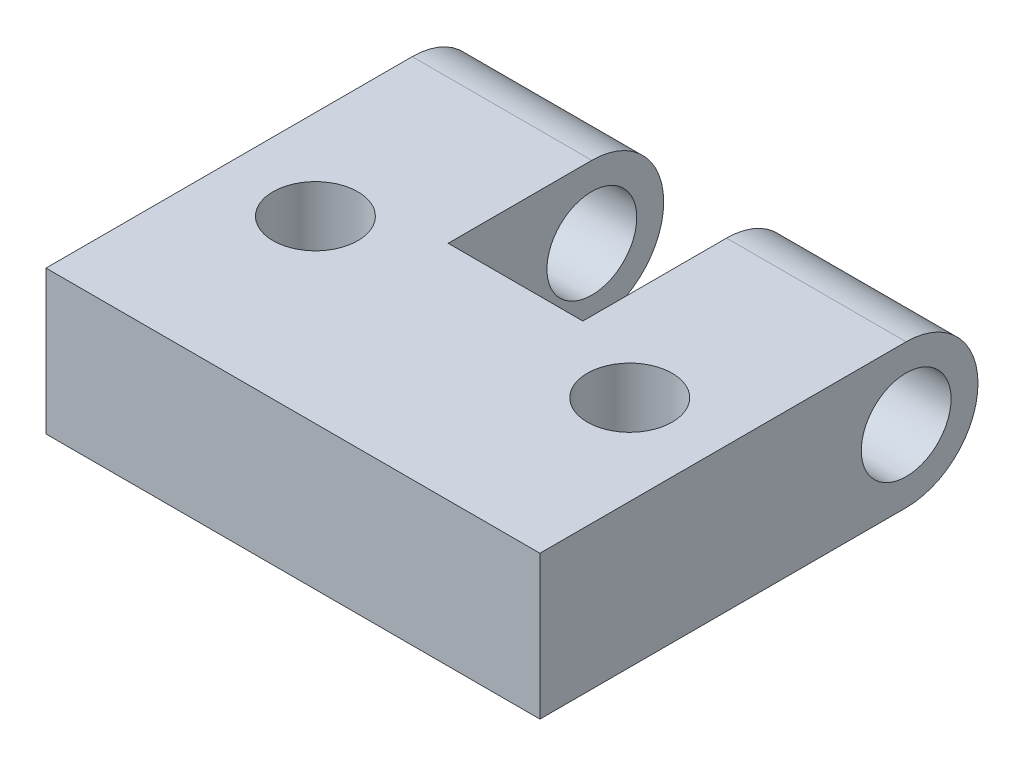
ISO-10303-21;
HEADER;
FILE_DESCRIPTION(('STEP AP214'),'2;1');
FILE_NAME('part.step','',(''),(''),'','','');
FILE_SCHEMA(('AUTOMOTIVE_DESIGN { 1 0 10303 214 1 1 1 1 }'));
ENDSEC;
DATA;
#1=APPLICATION_CONTEXT('core data for automotive mechanical design processes');
#2=APPLICATION_PROTOCOL_DEFINITION('international standard','automotive_design',2000,#1);
#3=PRODUCT_CONTEXT('',#1,'mechanical');
#4=PRODUCT('Part','Part','',(#3));
#5=PRODUCT_RELATED_PRODUCT_CATEGORY('part','',(#4));
#6=PRODUCT_DEFINITION_FORMATION('','',#4);
#7=PRODUCT_DEFINITION_CONTEXT('part definition',#1,'design');
#8=PRODUCT_DEFINITION('design','',#6,#7);
#9=PRODUCT_DEFINITION_SHAPE('','',#8);
#10=(LENGTH_UNIT() NAMED_UNIT(*) SI_UNIT(.MILLI.,.METRE.));
#11=(NAMED_UNIT(*) PLANE_ANGLE_UNIT() SI_UNIT($,.RADIAN.));
#12=(NAMED_UNIT(*) SI_UNIT($,.STERADIAN.) SOLID_ANGLE_UNIT());
#13=UNCERTAINTY_MEASURE_WITH_UNIT(LENGTH_MEASURE(1.E-05),#10,'distance_accuracy_value','');
#14=(GEOMETRIC_REPRESENTATION_CONTEXT(3) GLOBAL_UNCERTAINTY_ASSIGNED_CONTEXT((#13)) GLOBAL_UNIT_ASSIGNED_CONTEXT((#10,
#11,#12)) REPRESENTATION_CONTEXT('',''));
#15=CARTESIAN_POINT('',(0.,0.,0.));
#16=DIRECTION('',(0.,0.,1.));
#17=DIRECTION('',(1.,0.,0.));
#18=AXIS2_PLACEMENT_3D('',#15,#16,#17);
#19=CARTESIAN_POINT('',(6.35,5.08,0.));
#20=DIRECTION('',(0.,-1.,0.));
#21=DIRECTION('',(0.,0.,-1.));
#22=AXIS2_PLACEMENT_3D('',#19,#20,#21);
#23=PLANE('',#22);
#24=CARTESIAN_POINT('',(14.2875,5.08,0.));
#25=DIRECTION('',(0.,-1.,0.));
#26=DIRECTION('',(0.,0.,1.));
#27=AXIS2_PLACEMENT_3D('',#24,#25,#26);
#28=CIRCLE('',#27,1.5);
#29=CARTESIAN_POINT('',(14.2875,5.08,1.5));
#30=VERTEX_POINT('',#29);
#31=EDGE_CURVE('E171',#30,#30,#28,.T.);
#32=ORIENTED_EDGE('',*,*,#31,.T.);
#33=EDGE_LOOP('',(#32));
#34=FACE_BOUND('',#33,.T.);
#35=CARTESIAN_POINT('',(3.175,5.08,0.));
#36=DIRECTION('',(0.,1.,0.));
#37=DIRECTION('',(0.,0.,1.));
#38=AXIS2_PLACEMENT_3D('',#35,#36,#37);
#39=CIRCLE('',#38,1.5);
#40=CARTESIAN_POINT('',(3.175,5.08,1.5));
#41=VERTEX_POINT('',#40);
#42=EDGE_CURVE('E127',#41,#41,#39,.T.);
#43=ORIENTED_EDGE('',*,*,#42,.F.);
#44=EDGE_LOOP('',(#43));
#45=FACE_BOUND('',#44,.T.);
#46=DIRECTION('',(0.,0.,1.));
#47=VECTOR('',#46,1.);
#48=CARTESIAN_POINT('',(0.,5.08,0.));
#49=LINE('',#48,#47);
#50=CARTESIAN_POINT('',(0.,5.08,-6.59780487804878));
#51=VERTEX_POINT('',#50);
#52=CARTESIAN_POINT('',(0.,5.08,6.35));
#53=VERTEX_POINT('',#52);
#54=EDGE_CURVE('E80',#51,#53,#49,.T.);
#55=ORIENTED_EDGE('',*,*,#54,.T.);
#56=DIRECTION('',(-1.,0.,0.));
#57=VECTOR('',#56,1.);
#58=CARTESIAN_POINT('',(6.35,5.08,6.35));
#59=LINE('',#58,#57);
#60=CARTESIAN_POINT('',(17.4625,5.08,6.35));
#61=VERTEX_POINT('',#60);
#62=EDGE_CURVE('E11',#61,#53,#59,.T.);
#63=ORIENTED_EDGE('',*,*,#62,.F.);
#64=DIRECTION('',(0.,0.,1.));
#65=VECTOR('',#64,1.);
#66=CARTESIAN_POINT('',(17.4625,5.08,0.));
#67=LINE('',#66,#65);
#68=CARTESIAN_POINT('',(17.4625,5.08,-6.59780487804878));
#69=VERTEX_POINT('',#68);
#70=EDGE_CURVE('E157',#69,#61,#67,.T.);
#71=ORIENTED_EDGE('',*,*,#70,.F.);
#72=DIRECTION('',(1.,0.,0.));
#73=VECTOR('',#72,1.);
#74=CARTESIAN_POINT('',(11.1125,5.08,-6.59780487804878));
#75=LINE('',#74,#73);
#76=CARTESIAN_POINT('',(11.1125,5.08,-6.59780487804878));
#77=VERTEX_POINT('',#76);
#78=EDGE_CURVE('E139',#77,#69,#75,.T.);
#79=ORIENTED_EDGE('',*,*,#78,.F.);
#80=DIRECTION('',(0.,0.,1.));
#81=VECTOR('',#80,1.);
#82=CARTESIAN_POINT('',(11.1125,5.08,0.));
#83=LINE('',#82,#81);
#84=CARTESIAN_POINT('',(11.1125,5.08,-1.51780487804878));
#85=VERTEX_POINT('',#84);
#86=EDGE_CURVE('E150',#77,#85,#83,.T.);
#87=ORIENTED_EDGE('',*,*,#86,.T.);
#88=DIRECTION('',(-1.,0.,0.));
#89=VECTOR('',#88,1.);
#90=CARTESIAN_POINT('',(11.1125,5.08,-1.51780487804878));
#91=LINE('',#90,#89);
#92=CARTESIAN_POINT('',(6.35,5.08,-1.51780487804878));
#93=VERTEX_POINT('',#92);
#94=EDGE_CURVE('E135',#85,#93,#91,.T.);
#95=ORIENTED_EDGE('',*,*,#94,.T.);
#96=DIRECTION('',(0.,0.,1.));
#97=VECTOR('',#96,1.);
#98=CARTESIAN_POINT('',(6.35,5.08,0.));
#99=LINE('',#98,#97);
#100=CARTESIAN_POINT('',(6.35,5.08,-6.59780487804878));
#101=VERTEX_POINT('',#100);
#102=EDGE_CURVE('E82',#101,#93,#99,.T.);
#103=ORIENTED_EDGE('',*,*,#102,.F.);
#104=DIRECTION('',(-1.,0.,0.));
#105=VECTOR('',#104,1.);
#106=CARTESIAN_POINT('',(6.35,5.08,-6.59780487804878));
#107=LINE('',#106,#105);
#108=EDGE_CURVE('E60',#101,#51,#107,.T.);
#109=ORIENTED_EDGE('',*,*,#108,.T.);
#110=EDGE_LOOP('',(#55,#63,#71,#79,#87,#95,#103,#109));
#111=FACE_BOUND('',#110,.T.);
#112=ADVANCED_FACE('F37',(#34,#45,#111),#23,.F.);
#113=CARTESIAN_POINT('',(6.35,0.,6.35));
#114=DIRECTION('',(0.,0.,-1.));
#115=DIRECTION('',(0.,1.,0.));
#116=AXIS2_PLACEMENT_3D('',#113,#114,#115);
#117=PLANE('',#116);
#118=DIRECTION('',(0.,-1.,0.));
#119=VECTOR('',#118,1.);
#120=CARTESIAN_POINT('',(0.,0.,6.35));
#121=LINE('',#120,#119);
#122=CARTESIAN_POINT('',(0.,0.,6.35));
#123=VERTEX_POINT('',#122);
#124=EDGE_CURVE('E94',#53,#123,#121,.T.);
#125=ORIENTED_EDGE('',*,*,#124,.T.);
#126=DIRECTION('',(-1.,0.,0.));
#127=VECTOR('',#126,1.);
#128=CARTESIAN_POINT('',(6.35,0.,6.35));
#129=LINE('',#128,#127);
#130=CARTESIAN_POINT('',(17.4625,0.,6.35));
#131=VERTEX_POINT('',#130);
#132=EDGE_CURVE('E44',#131,#123,#129,.T.);
#133=ORIENTED_EDGE('',*,*,#132,.F.);
#134=DIRECTION('',(0.,-1.,0.));
#135=VECTOR('',#134,1.);
#136=CARTESIAN_POINT('',(17.4625,0.,6.35));
#137=LINE('',#136,#135);
#138=EDGE_CURVE('E151',#61,#131,#137,.T.);
#139=ORIENTED_EDGE('',*,*,#138,.F.);
#140=ORIENTED_EDGE('',*,*,#62,.T.);
#141=EDGE_LOOP('',(#125,#133,#139,#140));
#142=FACE_BOUND('',#141,.T.);
#143=ADVANCED_FACE('F118',(#142),#117,.F.);
#144=CARTESIAN_POINT('',(6.35,0.,0.));
#145=DIRECTION('',(0.,-1.,0.));
#146=DIRECTION('',(0.,0.,-1.));
#147=AXIS2_PLACEMENT_3D('',#144,#145,#146);
#148=PLANE('',#147);
#149=CARTESIAN_POINT('',(14.2875,0.,0.));
#150=DIRECTION('',(0.,-1.,0.));
#151=DIRECTION('',(0.,0.,1.));
#152=AXIS2_PLACEMENT_3D('',#149,#150,#151);
#153=CIRCLE('',#152,1.5);
#154=CARTESIAN_POINT('',(14.2875,0.,1.5));
#155=VERTEX_POINT('',#154);
#156=EDGE_CURVE('E160',#155,#155,#153,.T.);
#157=ORIENTED_EDGE('',*,*,#156,.F.);
#158=EDGE_LOOP('',(#157));
#159=FACE_BOUND('',#158,.T.);
#160=CARTESIAN_POINT('',(3.175,0.,0.));
#161=DIRECTION('',(0.,1.,0.));
#162=DIRECTION('',(0.,0.,1.));
#163=AXIS2_PLACEMENT_3D('',#160,#161,#162);
#164=CIRCLE('',#163,1.5);
#165=CARTESIAN_POINT('',(3.175,0.,1.5));
#166=VERTEX_POINT('',#165);
#167=EDGE_CURVE('E95',#166,#166,#164,.T.);
#168=ORIENTED_EDGE('',*,*,#167,.T.);
#169=EDGE_LOOP('',(#168));
#170=FACE_BOUND('',#169,.T.);
#171=DIRECTION('',(0.,0.,1.));
#172=VECTOR('',#171,1.);
#173=CARTESIAN_POINT('',(0.,0.,0.));
#174=LINE('',#173,#172);
#175=CARTESIAN_POINT('',(0.,0.,-6.59780487804878));
#176=VERTEX_POINT('',#175);
#177=EDGE_CURVE('E100',#176,#123,#174,.T.);
#178=ORIENTED_EDGE('',*,*,#177,.F.);
#179=DIRECTION('',(-1.,0.,0.));
#180=VECTOR('',#179,1.);
#181=CARTESIAN_POINT('',(6.35,0.,-6.59780487804878));
#182=LINE('',#181,#180);
#183=CARTESIAN_POINT('',(6.35,0.,-6.59780487804878));
#184=VERTEX_POINT('',#183);
#185=EDGE_CURVE('E84',#184,#176,#182,.T.);
#186=ORIENTED_EDGE('',*,*,#185,.F.);
#187=DIRECTION('',(0.,0.,1.));
#188=VECTOR('',#187,1.);
#189=CARTESIAN_POINT('',(6.35,0.,0.));
#190=LINE('',#189,#188);
#191=CARTESIAN_POINT('',(6.35,0.,-1.51780487804878));
#192=VERTEX_POINT('',#191);
#193=EDGE_CURVE('E124',#184,#192,#190,.T.);
#194=ORIENTED_EDGE('',*,*,#193,.T.);
#195=DIRECTION('',(-1.,0.,0.));
#196=VECTOR('',#195,1.);
#197=CARTESIAN_POINT('',(11.1125,0.,-1.51780487804878));
#198=LINE('',#197,#196);
#199=CARTESIAN_POINT('',(11.1125,0.,-1.51780487804878));
#200=VERTEX_POINT('',#199);
#201=EDGE_CURVE('E130',#200,#192,#198,.T.);
#202=ORIENTED_EDGE('',*,*,#201,.F.);
#203=DIRECTION('',(0.,0.,1.));
#204=VECTOR('',#203,1.);
#205=CARTESIAN_POINT('',(11.1125,0.,0.));
#206=LINE('',#205,#204);
#207=CARTESIAN_POINT('',(11.1125,0.,-6.59780487804878));
#208=VERTEX_POINT('',#207);
#209=EDGE_CURVE('E163',#208,#200,#206,.T.);
#210=ORIENTED_EDGE('',*,*,#209,.F.);
#211=DIRECTION('',(1.,0.,0.));
#212=VECTOR('',#211,1.);
#213=CARTESIAN_POINT('',(11.1125,0.,-6.59780487804878));
#214=LINE('',#213,#212);
#215=CARTESIAN_POINT('',(17.4625,0.,-6.59780487804878));
#216=VERTEX_POINT('',#215);
#217=EDGE_CURVE('E144',#208,#216,#214,.T.);
#218=ORIENTED_EDGE('',*,*,#217,.T.);
#219=DIRECTION('',(0.,0.,1.));
#220=VECTOR('',#219,1.);
#221=CARTESIAN_POINT('',(17.4625,0.,0.));
#222=LINE('',#221,#220);
#223=EDGE_CURVE('E114',#216,#131,#222,.T.);
#224=ORIENTED_EDGE('',*,*,#223,.T.);
#225=ORIENTED_EDGE('',*,*,#132,.T.);
#226=EDGE_LOOP('',(#178,#186,#194,#202,#210,#218,#224,#225));
#227=FACE_BOUND('',#226,.T.);
#228=ADVANCED_FACE('F110',(#159,#170,#227),#148,.T.);
#229=CARTESIAN_POINT('',(6.35,2.54,-6.59780487804878));
#230=DIRECTION('',(-1.,0.,0.));
#231=DIRECTION('',(0.,0.,1.));
#232=AXIS2_PLACEMENT_3D('',#229,#230,#231);
#233=CYLINDRICAL_SURFACE('',#232,2.54);
#234=CARTESIAN_POINT('',(0.,2.54,-6.59780487804878));
#235=DIRECTION('',(1.,0.,0.));
#236=DIRECTION('',(0.,0.,-1.));
#237=AXIS2_PLACEMENT_3D('',#234,#235,#236);
#238=CIRCLE('',#237,2.54);
#239=EDGE_CURVE('E92',#51,#176,#238,.F.);
#240=ORIENTED_EDGE('',*,*,#239,.F.);
#241=ORIENTED_EDGE('',*,*,#108,.F.);
#242=CARTESIAN_POINT('',(6.35,2.54,-6.59780487804878));
#243=DIRECTION('',(1.,0.,0.));
#244=DIRECTION('',(0.,0.,-1.));
#245=AXIS2_PLACEMENT_3D('',#242,#243,#244);
#246=CIRCLE('',#245,2.54);
#247=EDGE_CURVE('E122',#101,#184,#246,.F.);
#248=ORIENTED_EDGE('',*,*,#247,.T.);
#249=ORIENTED_EDGE('',*,*,#185,.T.);
#250=EDGE_LOOP('',(#240,#241,#248,#249));
#251=FACE_BOUND('',#250,.T.);
#252=ADVANCED_FACE('F97',(#251),#233,.T.);
#253=CARTESIAN_POINT('',(6.35,2.54,-6.59780487804878));
#254=DIRECTION('',(-1.,0.,0.));
#255=DIRECTION('',(0.,0.,1.));
#256=AXIS2_PLACEMENT_3D('',#253,#254,#255);
#257=CYLINDRICAL_SURFACE('',#256,1.5875);
#258=CARTESIAN_POINT('',(6.35,2.54,-6.59780487804878));
#259=DIRECTION('',(1.,0.,0.));
#260=DIRECTION('',(0.,0.,-1.));
#261=AXIS2_PLACEMENT_3D('',#258,#259,#260);
#262=CIRCLE('',#261,1.5875);
#263=CARTESIAN_POINT('',(6.35,2.54,-8.18530487804878));
#264=VERTEX_POINT('',#263);
#265=EDGE_CURVE('E85',#264,#264,#262,.T.);
#266=ORIENTED_EDGE('',*,*,#265,.T.);
#267=EDGE_LOOP('',(#266));
#268=FACE_BOUND('',#267,.T.);
#269=CARTESIAN_POINT('',(0.,2.54,-6.59780487804878));
#270=DIRECTION('',(1.,0.,0.));
#271=DIRECTION('',(0.,0.,-1.));
#272=AXIS2_PLACEMENT_3D('',#269,#270,#271);
#273=CIRCLE('',#272,1.5875);
#274=CARTESIAN_POINT('',(0.,2.54,-8.18530487804878));
#275=VERTEX_POINT('',#274);
#276=EDGE_CURVE('E99',#275,#275,#273,.T.);
#277=ORIENTED_EDGE('',*,*,#276,.F.);
#278=EDGE_LOOP('',(#277));
#279=FACE_BOUND('',#278,.T.);
#280=ADVANCED_FACE('F225',(#268,#279),#257,.F.);
#281=CARTESIAN_POINT('',(6.35,0.,0.));
#282=DIRECTION('',(1.,0.,0.));
#283=DIRECTION('',(0.,0.,-1.));
#284=AXIS2_PLACEMENT_3D('',#281,#282,#283);
#285=PLANE('',#284);
#286=DIRECTION('',(0.,1.,0.));
#287=VECTOR('',#286,1.);
#288=CARTESIAN_POINT('',(6.35,0.,-1.51780487804878));
#289=LINE('',#288,#287);
#290=EDGE_CURVE('E51',#192,#93,#289,.T.);
#291=ORIENTED_EDGE('',*,*,#290,.F.);
#292=ORIENTED_EDGE('',*,*,#193,.F.);
#293=ORIENTED_EDGE('',*,*,#247,.F.);
#294=ORIENTED_EDGE('',*,*,#102,.T.);
#295=EDGE_LOOP('',(#291,#292,#293,#294));
#296=FACE_BOUND('',#295,.T.);
#297=ORIENTED_EDGE('',*,*,#265,.F.);
#298=EDGE_LOOP('',(#297));
#299=FACE_BOUND('',#298,.T.);
#300=ADVANCED_FACE('F222',(#296,#299),#285,.T.);
#301=CARTESIAN_POINT('',(0.,0.,0.));
#302=DIRECTION('',(1.,0.,0.));
#303=DIRECTION('',(0.,0.,-1.));
#304=AXIS2_PLACEMENT_3D('',#301,#302,#303);
#305=PLANE('',#304);
#306=ORIENTED_EDGE('',*,*,#54,.F.);
#307=ORIENTED_EDGE('',*,*,#239,.T.);
#308=ORIENTED_EDGE('',*,*,#177,.T.);
#309=ORIENTED_EDGE('',*,*,#124,.F.);
#310=EDGE_LOOP('',(#306,#307,#308,#309));
#311=FACE_BOUND('',#310,.T.);
#312=ORIENTED_EDGE('',*,*,#276,.T.);
#313=EDGE_LOOP('',(#312));
#314=FACE_BOUND('',#313,.T.);
#315=ADVANCED_FACE('F89',(#311,#314),#305,.F.);
#316=CARTESIAN_POINT('',(3.175,0.,0.));
#317=DIRECTION('',(0.,1.,0.));
#318=DIRECTION('',(0.,0.,1.));
#319=AXIS2_PLACEMENT_3D('',#316,#317,#318);
#320=CYLINDRICAL_SURFACE('',#319,1.5);
#321=ORIENTED_EDGE('',*,*,#167,.F.);
#322=EDGE_LOOP('',(#321));
#323=FACE_BOUND('',#322,.T.);
#324=ORIENTED_EDGE('',*,*,#42,.T.);
#325=EDGE_LOOP('',(#324));
#326=FACE_BOUND('',#325,.T.);
#327=ADVANCED_FACE('F185',(#323,#326),#320,.F.);
#328=CARTESIAN_POINT('',(11.1125,0.,-1.51780487804878));
#329=DIRECTION('',(0.,0.,1.));
#330=DIRECTION('',(1.,0.,0.));
#331=AXIS2_PLACEMENT_3D('',#328,#329,#330);
#332=PLANE('',#331);
#333=ORIENTED_EDGE('',*,*,#290,.T.);
#334=ORIENTED_EDGE('',*,*,#94,.F.);
#335=DIRECTION('',(0.,1.,0.));
#336=VECTOR('',#335,1.);
#337=CARTESIAN_POINT('',(11.1125,0.,-1.51780487804878));
#338=LINE('',#337,#336);
#339=EDGE_CURVE('E137',#200,#85,#338,.T.);
#340=ORIENTED_EDGE('',*,*,#339,.F.);
#341=ORIENTED_EDGE('',*,*,#201,.T.);
#342=EDGE_LOOP('',(#333,#334,#340,#341));
#343=FACE_BOUND('',#342,.T.);
#344=ADVANCED_FACE('F188',(#343),#332,.F.);
#345=CARTESIAN_POINT('',(11.1125,2.54,-6.59780487804878));
#346=DIRECTION('',(1.,0.,0.));
#347=DIRECTION('',(0.,0.,-1.));
#348=AXIS2_PLACEMENT_3D('',#345,#346,#347);
#349=CYLINDRICAL_SURFACE('',#348,2.54);
#350=CARTESIAN_POINT('',(17.4625,2.54,-6.59780487804878));
#351=DIRECTION('',(1.,0.,0.));
#352=DIRECTION('',(0.,0.,-1.));
#353=AXIS2_PLACEMENT_3D('',#350,#351,#352);
#354=CIRCLE('',#353,2.54);
#355=EDGE_CURVE('E154',#69,#216,#354,.F.);
#356=ORIENTED_EDGE('',*,*,#355,.T.);
#357=ORIENTED_EDGE('',*,*,#217,.F.);
#358=CARTESIAN_POINT('',(11.1125,2.54,-6.59780487804878));
#359=DIRECTION('',(1.,0.,0.));
#360=DIRECTION('',(0.,0.,-1.));
#361=AXIS2_PLACEMENT_3D('',#358,#359,#360);
#362=CIRCLE('',#361,2.54);
#363=EDGE_CURVE('E166',#77,#208,#362,.F.);
#364=ORIENTED_EDGE('',*,*,#363,.F.);
#365=ORIENTED_EDGE('',*,*,#78,.T.);
#366=EDGE_LOOP('',(#356,#357,#364,#365));
#367=FACE_BOUND('',#366,.T.);
#368=ADVANCED_FACE('F214',(#367),#349,.T.);
#369=CARTESIAN_POINT('',(11.1125,2.54,-6.59780487804878));
#370=DIRECTION('',(1.,0.,0.));
#371=DIRECTION('',(0.,0.,-1.));
#372=AXIS2_PLACEMENT_3D('',#369,#370,#371);
#373=CYLINDRICAL_SURFACE('',#372,1.5875);
#374=CARTESIAN_POINT('',(11.1125,2.54,-6.59780487804878));
#375=DIRECTION('',(1.,0.,0.));
#376=DIRECTION('',(0.,0.,-1.));
#377=AXIS2_PLACEMENT_3D('',#374,#375,#376);
#378=CIRCLE('',#377,1.5875);
#379=CARTESIAN_POINT('',(11.1125,2.54,-8.18530487804878));
#380=VERTEX_POINT('',#379);
#381=EDGE_CURVE('E146',#380,#380,#378,.T.);
#382=ORIENTED_EDGE('',*,*,#381,.F.);
#383=EDGE_LOOP('',(#382));
#384=FACE_BOUND('',#383,.T.);
#385=CARTESIAN_POINT('',(17.4625,2.54,-6.59780487804878));
#386=DIRECTION('',(1.,0.,0.));
#387=DIRECTION('',(0.,0.,-1.));
#388=AXIS2_PLACEMENT_3D('',#385,#386,#387);
#389=CIRCLE('',#388,1.5875);
#390=CARTESIAN_POINT('',(17.4625,2.54,-8.18530487804878));
#391=VERTEX_POINT('',#390);
#392=EDGE_CURVE('E147',#391,#391,#389,.T.);
#393=ORIENTED_EDGE('',*,*,#392,.T.);
#394=EDGE_LOOP('',(#393));
#395=FACE_BOUND('',#394,.T.);
#396=ADVANCED_FACE('F209',(#384,#395),#373,.F.);
#397=CARTESIAN_POINT('',(11.1125,0.,0.));
#398=DIRECTION('',(-1.,0.,0.));
#399=DIRECTION('',(0.,0.,-1.));
#400=AXIS2_PLACEMENT_3D('',#397,#398,#399);
#401=PLANE('',#400);
#402=ORIENTED_EDGE('',*,*,#209,.T.);
#403=ORIENTED_EDGE('',*,*,#339,.T.);
#404=ORIENTED_EDGE('',*,*,#86,.F.);
#405=ORIENTED_EDGE('',*,*,#363,.T.);
#406=EDGE_LOOP('',(#402,#403,#404,#405));
#407=FACE_BOUND('',#406,.T.);
#408=ORIENTED_EDGE('',*,*,#381,.T.);
#409=EDGE_LOOP('',(#408));
#410=FACE_BOUND('',#409,.T.);
#411=ADVANCED_FACE('F204',(#407,#410),#401,.T.);
#412=CARTESIAN_POINT('',(17.4625,0.,0.));
#413=DIRECTION('',(-1.,0.,0.));
#414=DIRECTION('',(0.,0.,-1.));
#415=AXIS2_PLACEMENT_3D('',#412,#413,#414);
#416=PLANE('',#415);
#417=ORIENTED_EDGE('',*,*,#70,.T.);
#418=ORIENTED_EDGE('',*,*,#138,.T.);
#419=ORIENTED_EDGE('',*,*,#223,.F.);
#420=ORIENTED_EDGE('',*,*,#355,.F.);
#421=EDGE_LOOP('',(#417,#418,#419,#420));
#422=FACE_BOUND('',#421,.T.);
#423=ORIENTED_EDGE('',*,*,#392,.F.);
#424=EDGE_LOOP('',(#423));
#425=FACE_BOUND('',#424,.T.);
#426=ADVANCED_FACE('F199',(#422,#425),#416,.F.);
#427=CARTESIAN_POINT('',(14.2875,0.,0.));
#428=DIRECTION('',(0.,1.,0.));
#429=DIRECTION('',(0.,0.,1.));
#430=AXIS2_PLACEMENT_3D('',#427,#428,#429);
#431=CYLINDRICAL_SURFACE('',#430,1.5);
#432=ORIENTED_EDGE('',*,*,#156,.T.);
#433=EDGE_LOOP('',(#432));
#434=FACE_BOUND('',#433,.T.);
#435=ORIENTED_EDGE('',*,*,#31,.F.);
#436=EDGE_LOOP('',(#435));
#437=FACE_BOUND('',#436,.T.);
#438=ADVANCED_FACE('F177',(#434,#437),#431,.F.);
#439=CLOSED_SHELL('',(#112,#143,#228,#252,#280,#300,#315,#327,#344,#368,#396,#411,#426,#438));
#440=MANIFOLD_SOLID_BREP('B2',#439);
#441=ADVANCED_BREP_SHAPE_REPRESENTATION('',(#18,#440),#14);
#442=SHAPE_DEFINITION_REPRESENTATION(#9,#441);
ENDSEC;
END-ISO-10303-21;
